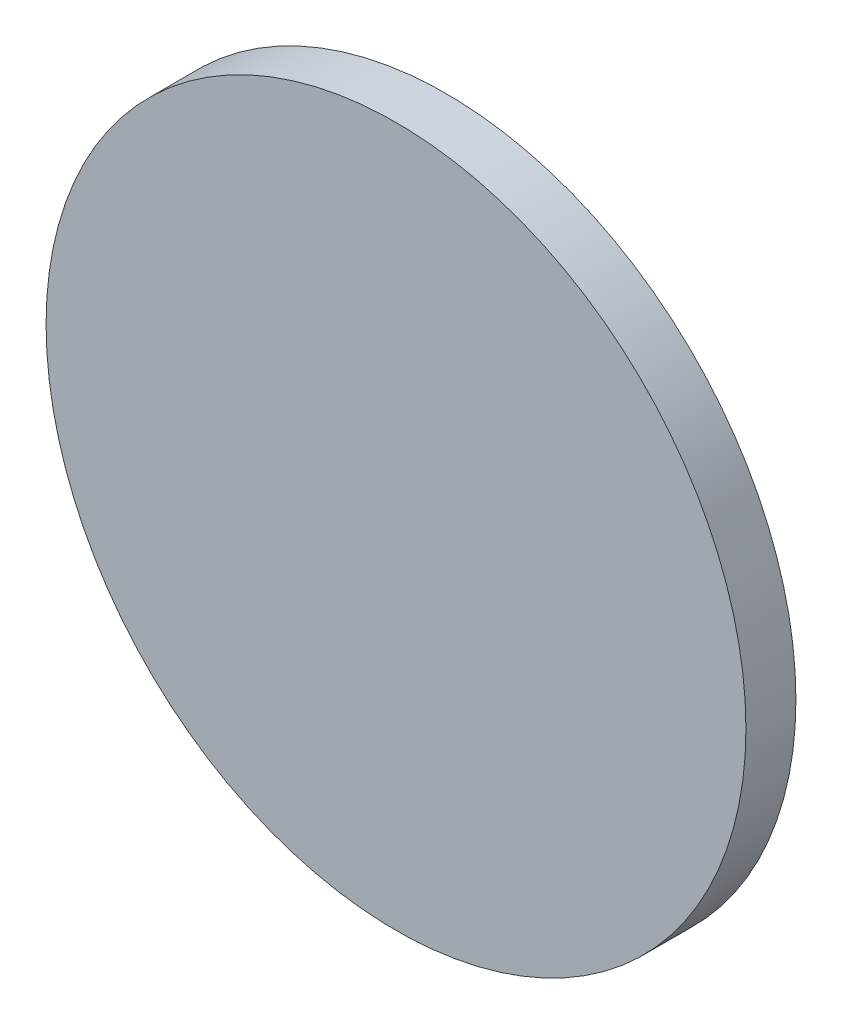
ISO-10303-21;
HEADER;
FILE_DESCRIPTION(('STEP AP214'),'2;1');
FILE_NAME('part.step','',(''),(''),'','','');
FILE_SCHEMA(('AUTOMOTIVE_DESIGN { 1 0 10303 214 1 1 1 1 }'));
ENDSEC;
DATA;
#1=APPLICATION_CONTEXT('core data for automotive mechanical design processes');
#2=APPLICATION_PROTOCOL_DEFINITION('international standard','automotive_design',2000,#1);
#3=PRODUCT_CONTEXT('',#1,'mechanical');
#4=PRODUCT('Part','Part','',(#3));
#5=PRODUCT_RELATED_PRODUCT_CATEGORY('part','',(#4));
#6=PRODUCT_DEFINITION_FORMATION('','',#4);
#7=PRODUCT_DEFINITION_CONTEXT('part definition',#1,'design');
#8=PRODUCT_DEFINITION('design','',#6,#7);
#9=PRODUCT_DEFINITION_SHAPE('','',#8);
#10=(LENGTH_UNIT() NAMED_UNIT(*) SI_UNIT(.MILLI.,.METRE.));
#11=(NAMED_UNIT(*) PLANE_ANGLE_UNIT() SI_UNIT($,.RADIAN.));
#12=(NAMED_UNIT(*) SI_UNIT($,.STERADIAN.) SOLID_ANGLE_UNIT());
#13=UNCERTAINTY_MEASURE_WITH_UNIT(LENGTH_MEASURE(1.E-05),#10,'distance_accuracy_value','');
#14=(GEOMETRIC_REPRESENTATION_CONTEXT(3) GLOBAL_UNCERTAINTY_ASSIGNED_CONTEXT((#13)) GLOBAL_UNIT_ASSIGNED_CONTEXT((#10,
#11,#12)) REPRESENTATION_CONTEXT('',''));
#15=CARTESIAN_POINT('',(0.,0.,0.));
#16=DIRECTION('',(0.,0.,1.));
#17=DIRECTION('',(1.,0.,0.));
#18=AXIS2_PLACEMENT_3D('',#15,#16,#17);
#19=CARTESIAN_POINT('',(0.,0.,0.));
#20=DIRECTION('',(0.,0.,1.));
#21=DIRECTION('',(1.,0.,0.));
#22=AXIS2_PLACEMENT_3D('',#19,#20,#21);
#23=PLANE('',#22);
#24=CARTESIAN_POINT('',(0.,0.,0.));
#25=DIRECTION('',(0.,0.,1.));
#26=DIRECTION('',(1.,0.,0.));
#27=AXIS2_PLACEMENT_3D('',#24,#25,#26);
#28=CIRCLE('',#27,70.);
#29=CARTESIAN_POINT('',(70.,0.,0.));
#30=VERTEX_POINT('',#29);
#31=EDGE_CURVE('E37',#30,#30,#28,.T.);
#32=ORIENTED_EDGE('',*,*,#31,.F.);
#33=EDGE_LOOP('',(#32));
#34=FACE_BOUND('',#33,.T.);
#35=DIRECTION('',(0.,1.,0.));
#36=VECTOR('',#35,1.);
#37=CARTESIAN_POINT('',(44.8105,-35.7485,0.));
#38=LINE('',#37,#36);
#39=CARTESIAN_POINT('',(44.8105,-35.7485,0.));
#40=VERTEX_POINT('',#39);
#41=CARTESIAN_POINT('',(44.8105,35.7485,0.));
#42=VERTEX_POINT('',#41);
#43=EDGE_CURVE('E48',#40,#42,#38,.T.);
#44=ORIENTED_EDGE('',*,*,#43,.T.);
#45=DIRECTION('',(-1.,0.,0.));
#46=VECTOR('',#45,1.);
#47=CARTESIAN_POINT('',(44.8105,35.7485,0.));
#48=LINE('',#47,#46);
#49=CARTESIAN_POINT('',(-44.8105,35.7485,0.));
#50=VERTEX_POINT('',#49);
#51=EDGE_CURVE('E103',#42,#50,#48,.T.);
#52=ORIENTED_EDGE('',*,*,#51,.T.);
#53=DIRECTION('',(0.,-1.,0.));
#54=VECTOR('',#53,1.);
#55=CARTESIAN_POINT('',(-44.8105,35.7485,0.));
#56=LINE('',#55,#54);
#57=CARTESIAN_POINT('',(-44.8105,-35.7485,0.));
#58=VERTEX_POINT('',#57);
#59=EDGE_CURVE('E93',#50,#58,#56,.T.);
#60=ORIENTED_EDGE('',*,*,#59,.T.);
#61=DIRECTION('',(1.,0.,0.));
#62=VECTOR('',#61,1.);
#63=CARTESIAN_POINT('',(-44.8105,-35.7485,0.));
#64=LINE('',#63,#62);
#65=EDGE_CURVE('E106',#58,#40,#64,.T.);
#66=ORIENTED_EDGE('',*,*,#65,.T.);
#67=EDGE_LOOP('',(#44,#52,#60,#66));
#68=FACE_BOUND('',#67,.T.);
#69=ADVANCED_FACE('F33',(#34,#68),#23,.F.);
#70=CARTESIAN_POINT('',(0.,0.,10.));
#71=DIRECTION('',(0.,0.,-1.));
#72=DIRECTION('',(-1.,0.,0.));
#73=AXIS2_PLACEMENT_3D('',#70,#71,#72);
#74=CYLINDRICAL_SURFACE('',#73,70.);
#75=CARTESIAN_POINT('',(0.,0.,10.));
#76=DIRECTION('',(0.,0.,1.));
#77=DIRECTION('',(1.,0.,0.));
#78=AXIS2_PLACEMENT_3D('',#75,#76,#77);
#79=CIRCLE('',#78,70.);
#80=CARTESIAN_POINT('',(70.,0.,10.));
#81=VERTEX_POINT('',#80);
#82=EDGE_CURVE('E11',#81,#81,#79,.T.);
#83=ORIENTED_EDGE('',*,*,#82,.F.);
#84=EDGE_LOOP('',(#83));
#85=FACE_BOUND('',#84,.T.);
#86=ORIENTED_EDGE('',*,*,#31,.T.);
#87=EDGE_LOOP('',(#86));
#88=FACE_BOUND('',#87,.T.);
#89=ADVANCED_FACE('F35',(#85,#88),#74,.T.);
#90=CARTESIAN_POINT('',(0.,0.,10.));
#91=DIRECTION('',(0.,0.,1.));
#92=DIRECTION('',(1.,0.,0.));
#93=AXIS2_PLACEMENT_3D('',#90,#91,#92);
#94=PLANE('',#93);
#95=ORIENTED_EDGE('',*,*,#82,.T.);
#96=EDGE_LOOP('',(#95));
#97=FACE_BOUND('',#96,.T.);
#98=ADVANCED_FACE('F120',(#97),#94,.T.);
#99=CARTESIAN_POINT('',(44.8105,-35.7485,5.));
#100=DIRECTION('',(-1.,0.,0.));
#101=DIRECTION('',(0.,0.,1.));
#102=AXIS2_PLACEMENT_3D('',#99,#100,#101);
#103=PLANE('',#102);
#104=ORIENTED_EDGE('',*,*,#43,.F.);
#105=DIRECTION('',(0.,0.,-1.));
#106=VECTOR('',#105,1.);
#107=CARTESIAN_POINT('',(44.8105,-35.7485,5.));
#108=LINE('',#107,#106);
#109=CARTESIAN_POINT('',(44.8105,-35.7485,5.));
#110=VERTEX_POINT('',#109);
#111=EDGE_CURVE('E98',#110,#40,#108,.T.);
#112=ORIENTED_EDGE('',*,*,#111,.F.);
#113=DIRECTION('',(0.,1.,0.));
#114=VECTOR('',#113,1.);
#115=CARTESIAN_POINT('',(44.8105,-35.7485,5.));
#116=LINE('',#115,#114);
#117=CARTESIAN_POINT('',(44.8105,35.7485,5.));
#118=VERTEX_POINT('',#117);
#119=EDGE_CURVE('E89',#110,#118,#116,.T.);
#120=ORIENTED_EDGE('',*,*,#119,.T.);
#121=DIRECTION('',(0.,0.,-1.));
#122=VECTOR('',#121,1.);
#123=CARTESIAN_POINT('',(44.8105,35.7485,5.));
#124=LINE('',#123,#122);
#125=EDGE_CURVE('E87',#118,#42,#124,.T.);
#126=ORIENTED_EDGE('',*,*,#125,.T.);
#127=EDGE_LOOP('',(#104,#112,#120,#126));
#128=FACE_BOUND('',#127,.T.);
#129=ADVANCED_FACE('F118',(#128),#103,.T.);
#130=CARTESIAN_POINT('',(44.8105,35.7485,5.));
#131=DIRECTION('',(0.,-1.,0.));
#132=DIRECTION('',(0.,0.,-1.));
#133=AXIS2_PLACEMENT_3D('',#130,#131,#132);
#134=PLANE('',#133);
#135=ORIENTED_EDGE('',*,*,#51,.F.);
#136=ORIENTED_EDGE('',*,*,#125,.F.);
#137=DIRECTION('',(-1.,0.,0.));
#138=VECTOR('',#137,1.);
#139=CARTESIAN_POINT('',(44.8105,35.7485,5.));
#140=LINE('',#139,#138);
#141=CARTESIAN_POINT('',(-44.8105,35.7485,5.));
#142=VERTEX_POINT('',#141);
#143=EDGE_CURVE('E80',#118,#142,#140,.T.);
#144=ORIENTED_EDGE('',*,*,#143,.T.);
#145=DIRECTION('',(0.,0.,-1.));
#146=VECTOR('',#145,1.);
#147=CARTESIAN_POINT('',(-44.8105,35.7485,5.));
#148=LINE('',#147,#146);
#149=EDGE_CURVE('E86',#142,#50,#148,.T.);
#150=ORIENTED_EDGE('',*,*,#149,.T.);
#151=EDGE_LOOP('',(#135,#136,#144,#150));
#152=FACE_BOUND('',#151,.T.);
#153=ADVANCED_FACE('F85',(#152),#134,.T.);
#154=CARTESIAN_POINT('',(-44.8105,35.7485,5.));
#155=DIRECTION('',(1.,0.,0.));
#156=DIRECTION('',(0.,0.,-1.));
#157=AXIS2_PLACEMENT_3D('',#154,#155,#156);
#158=PLANE('',#157);
#159=ORIENTED_EDGE('',*,*,#59,.F.);
#160=ORIENTED_EDGE('',*,*,#149,.F.);
#161=DIRECTION('',(0.,-1.,0.));
#162=VECTOR('',#161,1.);
#163=CARTESIAN_POINT('',(-44.8105,35.7485,5.));
#164=LINE('',#163,#162);
#165=CARTESIAN_POINT('',(-44.8105,-35.7485,5.));
#166=VERTEX_POINT('',#165);
#167=EDGE_CURVE('E88',#142,#166,#164,.T.);
#168=ORIENTED_EDGE('',*,*,#167,.T.);
#169=DIRECTION('',(0.,0.,-1.));
#170=VECTOR('',#169,1.);
#171=CARTESIAN_POINT('',(-44.8105,-35.7485,5.));
#172=LINE('',#171,#170);
#173=EDGE_CURVE('E72',#166,#58,#172,.T.);
#174=ORIENTED_EDGE('',*,*,#173,.T.);
#175=EDGE_LOOP('',(#159,#160,#168,#174));
#176=FACE_BOUND('',#175,.T.);
#177=ADVANCED_FACE('F91',(#176),#158,.T.);
#178=CARTESIAN_POINT('',(-44.8105,-35.7485,5.));
#179=DIRECTION('',(0.,1.,0.));
#180=DIRECTION('',(0.,0.,1.));
#181=AXIS2_PLACEMENT_3D('',#178,#179,#180);
#182=PLANE('',#181);
#183=ORIENTED_EDGE('',*,*,#65,.F.);
#184=ORIENTED_EDGE('',*,*,#173,.F.);
#185=DIRECTION('',(1.,0.,0.));
#186=VECTOR('',#185,1.);
#187=CARTESIAN_POINT('',(-44.8105,-35.7485,5.));
#188=LINE('',#187,#186);
#189=EDGE_CURVE('E56',#166,#110,#188,.T.);
#190=ORIENTED_EDGE('',*,*,#189,.T.);
#191=ORIENTED_EDGE('',*,*,#111,.T.);
#192=EDGE_LOOP('',(#183,#184,#190,#191));
#193=FACE_BOUND('',#192,.T.);
#194=ADVANCED_FACE('F117',(#193),#182,.T.);
#195=CARTESIAN_POINT('',(0.,0.,5.));
#196=DIRECTION('',(0.,0.,1.));
#197=DIRECTION('',(1.,0.,0.));
#198=AXIS2_PLACEMENT_3D('',#195,#196,#197);
#199=PLANE('',#198);
#200=ORIENTED_EDGE('',*,*,#119,.F.);
#201=ORIENTED_EDGE('',*,*,#189,.F.);
#202=ORIENTED_EDGE('',*,*,#167,.F.);
#203=ORIENTED_EDGE('',*,*,#143,.F.);
#204=EDGE_LOOP('',(#200,#201,#202,#203));
#205=FACE_BOUND('',#204,.T.);
#206=ADVANCED_FACE('F96',(#205),#199,.F.);
#207=CLOSED_SHELL('',(#69,#89,#98,#129,#153,#177,#194,#206));
#208=MANIFOLD_SOLID_BREP('B2',#207);
#209=ADVANCED_BREP_SHAPE_REPRESENTATION('',(#18,#208),#14);
#210=SHAPE_DEFINITION_REPRESENTATION(#9,#209);
ENDSEC;
END-ISO-10303-21;
